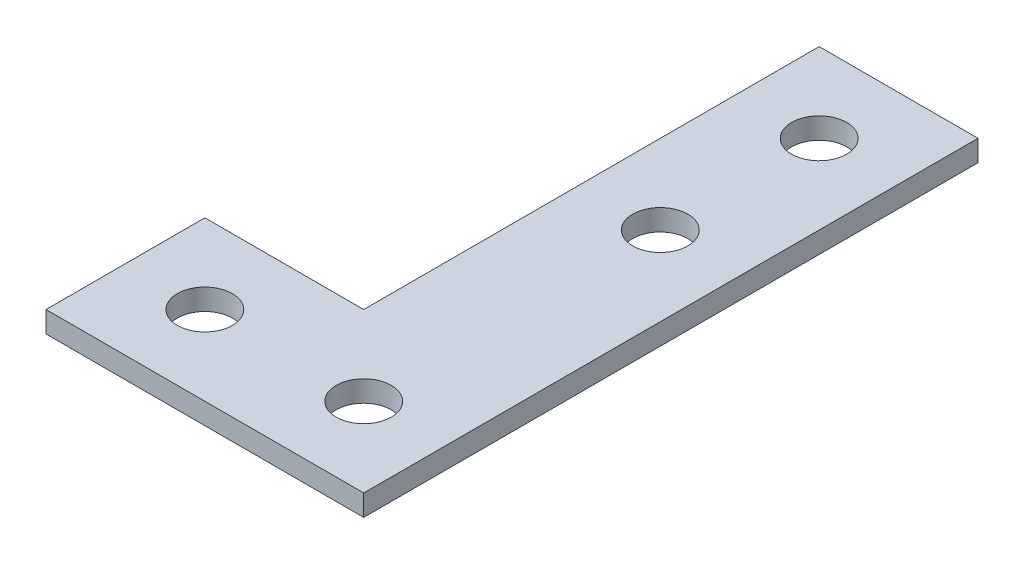
ISO-10303-21;
HEADER;
FILE_DESCRIPTION(('STEP AP214'),'2;1');
FILE_NAME('part.step','',(''),(''),'','','');
FILE_SCHEMA(('AUTOMOTIVE_DESIGN { 1 0 10303 214 1 1 1 1 }'));
ENDSEC;
DATA;
#1=APPLICATION_CONTEXT('core data for automotive mechanical design processes');
#2=APPLICATION_PROTOCOL_DEFINITION('international standard','automotive_design',2000,#1);
#3=PRODUCT_CONTEXT('',#1,'mechanical');
#4=PRODUCT('Part','Part','',(#3));
#5=PRODUCT_RELATED_PRODUCT_CATEGORY('part','',(#4));
#6=PRODUCT_DEFINITION_FORMATION('','',#4);
#7=PRODUCT_DEFINITION_CONTEXT('part definition',#1,'design');
#8=PRODUCT_DEFINITION('design','',#6,#7);
#9=PRODUCT_DEFINITION_SHAPE('','',#8);
#10=(LENGTH_UNIT() NAMED_UNIT(*) SI_UNIT(.MILLI.,.METRE.));
#11=(NAMED_UNIT(*) PLANE_ANGLE_UNIT() SI_UNIT($,.RADIAN.));
#12=(NAMED_UNIT(*) SI_UNIT($,.STERADIAN.) SOLID_ANGLE_UNIT());
#13=UNCERTAINTY_MEASURE_WITH_UNIT(LENGTH_MEASURE(1.E-05),#10,'distance_accuracy_value','');
#14=(GEOMETRIC_REPRESENTATION_CONTEXT(3) GLOBAL_UNCERTAINTY_ASSIGNED_CONTEXT((#13)) GLOBAL_UNIT_ASSIGNED_CONTEXT((#10,
#11,#12)) REPRESENTATION_CONTEXT('',''));
#15=CARTESIAN_POINT('',(0.,0.,0.));
#16=DIRECTION('',(0.,0.,1.));
#17=DIRECTION('',(1.,0.,0.));
#18=AXIS2_PLACEMENT_3D('',#15,#16,#17);
#19=CARTESIAN_POINT('',(7.5,2.,0.));
#20=DIRECTION('',(1.,0.,0.));
#21=DIRECTION('',(0.,0.,-1.));
#22=AXIS2_PLACEMENT_3D('',#19,#20,#21);
#23=PLANE('',#22);
#24=DIRECTION('',(0.,0.,1.));
#25=VECTOR('',#24,1.);
#26=CARTESIAN_POINT('',(7.5,0.,0.));
#27=LINE('',#26,#25);
#28=CARTESIAN_POINT('',(7.5,0.,-43.));
#29=VERTEX_POINT('',#28);
#30=CARTESIAN_POINT('',(7.5,0.,15.));
#31=VERTEX_POINT('',#30);
#32=EDGE_CURVE('E148',#29,#31,#27,.T.);
#33=ORIENTED_EDGE('',*,*,#32,.F.);
#34=DIRECTION('',(0.,-1.,0.));
#35=VECTOR('',#34,1.);
#36=CARTESIAN_POINT('',(7.5,2.,-43.));
#37=LINE('',#36,#35);
#38=CARTESIAN_POINT('',(7.5,2.,-43.));
#39=VERTEX_POINT('',#38);
#40=EDGE_CURVE('E11',#39,#29,#37,.T.);
#41=ORIENTED_EDGE('',*,*,#40,.F.);
#42=DIRECTION('',(0.,0.,1.));
#43=VECTOR('',#42,1.);
#44=CARTESIAN_POINT('',(7.5,2.,0.));
#45=LINE('',#44,#43);
#46=CARTESIAN_POINT('',(7.5,2.,15.));
#47=VERTEX_POINT('',#46);
#48=EDGE_CURVE('E184',#39,#47,#45,.T.);
#49=ORIENTED_EDGE('',*,*,#48,.T.);
#50=DIRECTION('',(0.,-1.,0.));
#51=VECTOR('',#50,1.);
#52=CARTESIAN_POINT('',(7.5,2.,15.));
#53=LINE('',#52,#51);
#54=EDGE_CURVE('E62',#47,#31,#53,.T.);
#55=ORIENTED_EDGE('',*,*,#54,.T.);
#56=EDGE_LOOP('',(#33,#41,#49,#55));
#57=FACE_BOUND('',#56,.T.);
#58=ADVANCED_FACE('F45',(#57),#23,.T.);
#59=CARTESIAN_POINT('',(0.,2.,-43.));
#60=DIRECTION('',(0.,0.,-1.));
#61=DIRECTION('',(-1.,0.,0.));
#62=AXIS2_PLACEMENT_3D('',#59,#60,#61);
#63=PLANE('',#62);
#64=DIRECTION('',(1.,0.,0.));
#65=VECTOR('',#64,1.);
#66=CARTESIAN_POINT('',(0.,0.,-43.));
#67=LINE('',#66,#65);
#68=CARTESIAN_POINT('',(-7.5,0.,-43.));
#69=VERTEX_POINT('',#68);
#70=EDGE_CURVE('E151',#69,#29,#67,.T.);
#71=ORIENTED_EDGE('',*,*,#70,.F.);
#72=DIRECTION('',(0.,-1.,0.));
#73=VECTOR('',#72,1.);
#74=CARTESIAN_POINT('',(-7.5,2.,-43.));
#75=LINE('',#74,#73);
#76=CARTESIAN_POINT('',(-7.5,2.,-43.));
#77=VERTEX_POINT('',#76);
#78=EDGE_CURVE('E54',#77,#69,#75,.T.);
#79=ORIENTED_EDGE('',*,*,#78,.F.);
#80=DIRECTION('',(1.,0.,0.));
#81=VECTOR('',#80,1.);
#82=CARTESIAN_POINT('',(0.,2.,-43.));
#83=LINE('',#82,#81);
#84=EDGE_CURVE('E361',#77,#39,#83,.T.);
#85=ORIENTED_EDGE('',*,*,#84,.T.);
#86=ORIENTED_EDGE('',*,*,#40,.T.);
#87=EDGE_LOOP('',(#71,#79,#85,#86));
#88=FACE_BOUND('',#87,.T.);
#89=ADVANCED_FACE('F197',(#88),#63,.T.);
#90=CARTESIAN_POINT('',(-7.5,2.,0.));
#91=DIRECTION('',(-1.,0.,0.));
#92=DIRECTION('',(0.,0.,1.));
#93=AXIS2_PLACEMENT_3D('',#90,#91,#92);
#94=PLANE('',#93);
#95=DIRECTION('',(0.,0.,-1.));
#96=VECTOR('',#95,1.);
#97=CARTESIAN_POINT('',(-7.5,0.,0.));
#98=LINE('',#97,#96);
#99=CARTESIAN_POINT('',(-7.5,0.,0.));
#100=VERTEX_POINT('',#99);
#101=EDGE_CURVE('E155',#100,#69,#98,.T.);
#102=ORIENTED_EDGE('',*,*,#101,.F.);
#103=DIRECTION('',(0.,-1.,0.));
#104=VECTOR('',#103,1.);
#105=CARTESIAN_POINT('',(-7.5,2.,0.));
#106=LINE('',#105,#104);
#107=CARTESIAN_POINT('',(-7.5,2.,0.));
#108=VERTEX_POINT('',#107);
#109=EDGE_CURVE('E122',#108,#100,#106,.T.);
#110=ORIENTED_EDGE('',*,*,#109,.F.);
#111=DIRECTION('',(0.,0.,-1.));
#112=VECTOR('',#111,1.);
#113=CARTESIAN_POINT('',(-7.5,2.,0.));
#114=LINE('',#113,#112);
#115=EDGE_CURVE('E110',#108,#77,#114,.T.);
#116=ORIENTED_EDGE('',*,*,#115,.T.);
#117=ORIENTED_EDGE('',*,*,#78,.T.);
#118=EDGE_LOOP('',(#102,#110,#116,#117));
#119=FACE_BOUND('',#118,.T.);
#120=ADVANCED_FACE('F194',(#119),#94,.T.);
#121=CARTESIAN_POINT('',(0.,2.,0.));
#122=DIRECTION('',(0.,0.,1.));
#123=DIRECTION('',(1.,0.,0.));
#124=AXIS2_PLACEMENT_3D('',#121,#122,#123);
#125=PLANE('',#124);
#126=DIRECTION('',(-1.,0.,0.));
#127=VECTOR('',#126,1.);
#128=CARTESIAN_POINT('',(0.,0.,0.));
#129=LINE('',#128,#127);
#130=CARTESIAN_POINT('',(-22.5,0.,0.));
#131=VERTEX_POINT('',#130);
#132=EDGE_CURVE('E118',#100,#131,#129,.T.);
#133=ORIENTED_EDGE('',*,*,#132,.T.);
#134=DIRECTION('',(0.,-1.,0.));
#135=VECTOR('',#134,1.);
#136=CARTESIAN_POINT('',(-22.5,2.,0.));
#137=LINE('',#136,#135);
#138=CARTESIAN_POINT('',(-22.5,2.,0.));
#139=VERTEX_POINT('',#138);
#140=EDGE_CURVE('E115',#139,#131,#137,.T.);
#141=ORIENTED_EDGE('',*,*,#140,.F.);
#142=DIRECTION('',(-1.,0.,0.));
#143=VECTOR('',#142,1.);
#144=CARTESIAN_POINT('',(0.,2.,0.));
#145=LINE('',#144,#143);
#146=EDGE_CURVE('E101',#108,#139,#145,.T.);
#147=ORIENTED_EDGE('',*,*,#146,.F.);
#148=ORIENTED_EDGE('',*,*,#109,.T.);
#149=EDGE_LOOP('',(#133,#141,#147,#148));
#150=FACE_BOUND('',#149,.T.);
#151=ADVANCED_FACE('F116',(#150),#125,.F.);
#152=CARTESIAN_POINT('',(-22.5,2.,0.));
#153=DIRECTION('',(1.,0.,0.));
#154=DIRECTION('',(0.,0.,-1.));
#155=AXIS2_PLACEMENT_3D('',#152,#153,#154);
#156=PLANE('',#155);
#157=DIRECTION('',(0.,0.,1.));
#158=VECTOR('',#157,1.);
#159=CARTESIAN_POINT('',(-22.5,0.,0.));
#160=LINE('',#159,#158);
#161=CARTESIAN_POINT('',(-22.5,0.,15.));
#162=VERTEX_POINT('',#161);
#163=EDGE_CURVE('E161',#131,#162,#160,.T.);
#164=ORIENTED_EDGE('',*,*,#163,.T.);
#165=DIRECTION('',(0.,-1.,0.));
#166=VECTOR('',#165,1.);
#167=CARTESIAN_POINT('',(-22.5,2.,15.));
#168=LINE('',#167,#166);
#169=CARTESIAN_POINT('',(-22.5,2.,15.));
#170=VERTEX_POINT('',#169);
#171=EDGE_CURVE('E82',#170,#162,#168,.T.);
#172=ORIENTED_EDGE('',*,*,#171,.F.);
#173=DIRECTION('',(0.,0.,1.));
#174=VECTOR('',#173,1.);
#175=CARTESIAN_POINT('',(-22.5,2.,0.));
#176=LINE('',#175,#174);
#177=EDGE_CURVE('E107',#139,#170,#176,.T.);
#178=ORIENTED_EDGE('',*,*,#177,.F.);
#179=ORIENTED_EDGE('',*,*,#140,.T.);
#180=EDGE_LOOP('',(#164,#172,#178,#179));
#181=FACE_BOUND('',#180,.T.);
#182=ADVANCED_FACE('F124',(#181),#156,.F.);
#183=CARTESIAN_POINT('',(-15.,2.,7.5));
#184=DIRECTION('',(0.,-1.,0.));
#185=DIRECTION('',(0.,0.,-1.));
#186=AXIS2_PLACEMENT_3D('',#183,#184,#185);
#187=CYLINDRICAL_SURFACE('',#186,2.6);
#188=CARTESIAN_POINT('',(-15.,2.,7.5));
#189=DIRECTION('',(0.,1.,0.));
#190=DIRECTION('',(0.,0.,1.));
#191=AXIS2_PLACEMENT_3D('',#188,#189,#190);
#192=CIRCLE('',#191,2.6);
#193=CARTESIAN_POINT('',(-15.,2.,10.1));
#194=VERTEX_POINT('',#193);
#195=EDGE_CURVE('E140',#194,#194,#192,.T.);
#196=ORIENTED_EDGE('',*,*,#195,.T.);
#197=EDGE_LOOP('',(#196));
#198=FACE_BOUND('',#197,.T.);
#199=CARTESIAN_POINT('',(-15.,0.,7.5));
#200=DIRECTION('',(0.,1.,0.));
#201=DIRECTION('',(0.,0.,1.));
#202=AXIS2_PLACEMENT_3D('',#199,#200,#201);
#203=CIRCLE('',#202,2.6);
#204=CARTESIAN_POINT('',(-15.,0.,10.1));
#205=VERTEX_POINT('',#204);
#206=EDGE_CURVE('E176',#205,#205,#203,.T.);
#207=ORIENTED_EDGE('',*,*,#206,.F.);
#208=EDGE_LOOP('',(#207));
#209=FACE_BOUND('',#208,.T.);
#210=ADVANCED_FACE('F227',(#198,#209),#187,.F.);
#211=CARTESIAN_POINT('',(0.,2.,-20.5));
#212=DIRECTION('',(0.,-1.,0.));
#213=DIRECTION('',(0.,0.,-1.));
#214=AXIS2_PLACEMENT_3D('',#211,#212,#213);
#215=CYLINDRICAL_SURFACE('',#214,2.6);
#216=CARTESIAN_POINT('',(0.,2.,-20.5));
#217=DIRECTION('',(0.,1.,0.));
#218=DIRECTION('',(0.,0.,1.));
#219=AXIS2_PLACEMENT_3D('',#216,#217,#218);
#220=CIRCLE('',#219,2.6);
#221=CARTESIAN_POINT('',(0.,2.,-17.9));
#222=VERTEX_POINT('',#221);
#223=EDGE_CURVE('E136',#222,#222,#220,.T.);
#224=ORIENTED_EDGE('',*,*,#223,.T.);
#225=EDGE_LOOP('',(#224));
#226=FACE_BOUND('',#225,.T.);
#227=CARTESIAN_POINT('',(0.,0.,-20.5));
#228=DIRECTION('',(0.,1.,0.));
#229=DIRECTION('',(0.,0.,1.));
#230=AXIS2_PLACEMENT_3D('',#227,#228,#229);
#231=CIRCLE('',#230,2.6);
#232=CARTESIAN_POINT('',(0.,0.,-17.9));
#233=VERTEX_POINT('',#232);
#234=EDGE_CURVE('E172',#233,#233,#231,.T.);
#235=ORIENTED_EDGE('',*,*,#234,.F.);
#236=EDGE_LOOP('',(#235));
#237=FACE_BOUND('',#236,.T.);
#238=ADVANCED_FACE('F212',(#226,#237),#215,.F.);
#239=CARTESIAN_POINT('',(0.,2.,-35.5));
#240=DIRECTION('',(0.,-1.,0.));
#241=DIRECTION('',(0.,0.,-1.));
#242=AXIS2_PLACEMENT_3D('',#239,#240,#241);
#243=CYLINDRICAL_SURFACE('',#242,2.6);
#244=CARTESIAN_POINT('',(0.,2.,-35.5));
#245=DIRECTION('',(0.,1.,0.));
#246=DIRECTION('',(0.,0.,1.));
#247=AXIS2_PLACEMENT_3D('',#244,#245,#246);
#248=CIRCLE('',#247,2.6);
#249=CARTESIAN_POINT('',(0.,2.,-32.9));
#250=VERTEX_POINT('',#249);
#251=EDGE_CURVE('E129',#250,#250,#248,.F.);
#252=ORIENTED_EDGE('',*,*,#251,.F.);
#253=EDGE_LOOP('',(#252));
#254=FACE_BOUND('',#253,.T.);
#255=CARTESIAN_POINT('',(0.,0.,-35.5));
#256=DIRECTION('',(0.,1.,0.));
#257=DIRECTION('',(0.,0.,1.));
#258=AXIS2_PLACEMENT_3D('',#255,#256,#257);
#259=CIRCLE('',#258,2.6);
#260=CARTESIAN_POINT('',(0.,0.,-32.9));
#261=VERTEX_POINT('',#260);
#262=EDGE_CURVE('E168',#261,#261,#259,.F.);
#263=ORIENTED_EDGE('',*,*,#262,.T.);
#264=EDGE_LOOP('',(#263));
#265=FACE_BOUND('',#264,.T.);
#266=ADVANCED_FACE('F204',(#254,#265),#243,.F.);
#267=CARTESIAN_POINT('',(0.,2.,15.));
#268=DIRECTION('',(0.,0.,1.));
#269=DIRECTION('',(1.,0.,0.));
#270=AXIS2_PLACEMENT_3D('',#267,#268,#269);
#271=PLANE('',#270);
#272=DIRECTION('',(-1.,0.,0.));
#273=VECTOR('',#272,1.);
#274=CARTESIAN_POINT('',(0.,0.,15.));
#275=LINE('',#274,#273);
#276=EDGE_CURVE('E164',#31,#162,#275,.T.);
#277=ORIENTED_EDGE('',*,*,#276,.F.);
#278=ORIENTED_EDGE('',*,*,#54,.F.);
#279=DIRECTION('',(-1.,0.,0.));
#280=VECTOR('',#279,1.);
#281=CARTESIAN_POINT('',(0.,2.,15.));
#282=LINE('',#281,#280);
#283=EDGE_CURVE('E126',#47,#170,#282,.T.);
#284=ORIENTED_EDGE('',*,*,#283,.T.);
#285=ORIENTED_EDGE('',*,*,#171,.T.);
#286=EDGE_LOOP('',(#277,#278,#284,#285));
#287=FACE_BOUND('',#286,.T.);
#288=ADVANCED_FACE('F201',(#287),#271,.T.);
#289=CARTESIAN_POINT('',(0.,2.,7.5));
#290=DIRECTION('',(0.,-1.,0.));
#291=DIRECTION('',(0.,0.,-1.));
#292=AXIS2_PLACEMENT_3D('',#289,#290,#291);
#293=CYLINDRICAL_SURFACE('',#292,2.6);
#294=CARTESIAN_POINT('',(0.,2.,7.5));
#295=DIRECTION('',(0.,1.,0.));
#296=DIRECTION('',(0.,0.,1.));
#297=AXIS2_PLACEMENT_3D('',#294,#295,#296);
#298=CIRCLE('',#297,2.6);
#299=CARTESIAN_POINT('',(0.,2.,10.1));
#300=VERTEX_POINT('',#299);
#301=EDGE_CURVE('E144',#300,#300,#298,.F.);
#302=ORIENTED_EDGE('',*,*,#301,.F.);
#303=EDGE_LOOP('',(#302));
#304=FACE_BOUND('',#303,.T.);
#305=CARTESIAN_POINT('',(0.,0.,7.5));
#306=DIRECTION('',(0.,1.,0.));
#307=DIRECTION('',(0.,0.,1.));
#308=AXIS2_PLACEMENT_3D('',#305,#306,#307);
#309=CIRCLE('',#308,2.6);
#310=CARTESIAN_POINT('',(0.,0.,10.1));
#311=VERTEX_POINT('',#310);
#312=EDGE_CURVE('E180',#311,#311,#309,.F.);
#313=ORIENTED_EDGE('',*,*,#312,.T.);
#314=EDGE_LOOP('',(#313));
#315=FACE_BOUND('',#314,.T.);
#316=ADVANCED_FACE('F203',(#304,#315),#293,.F.);
#317=CARTESIAN_POINT('',(0.,2.,0.));
#318=DIRECTION('',(0.,1.,0.));
#319=DIRECTION('',(0.,0.,1.));
#320=AXIS2_PLACEMENT_3D('',#317,#318,#319);
#321=PLANE('',#320);
#322=ORIENTED_EDGE('',*,*,#48,.F.);
#323=ORIENTED_EDGE('',*,*,#84,.F.);
#324=ORIENTED_EDGE('',*,*,#115,.F.);
#325=ORIENTED_EDGE('',*,*,#146,.T.);
#326=ORIENTED_EDGE('',*,*,#177,.T.);
#327=ORIENTED_EDGE('',*,*,#283,.F.);
#328=EDGE_LOOP('',(#322,#323,#324,#325,#326,#327));
#329=FACE_BOUND('',#328,.T.);
#330=ORIENTED_EDGE('',*,*,#251,.T.);
#331=EDGE_LOOP('',(#330));
#332=FACE_BOUND('',#331,.T.);
#333=ORIENTED_EDGE('',*,*,#223,.F.);
#334=EDGE_LOOP('',(#333));
#335=FACE_BOUND('',#334,.T.);
#336=ORIENTED_EDGE('',*,*,#195,.F.);
#337=EDGE_LOOP('',(#336));
#338=FACE_BOUND('',#337,.T.);
#339=ORIENTED_EDGE('',*,*,#301,.T.);
#340=EDGE_LOOP('',(#339));
#341=FACE_BOUND('',#340,.T.);
#342=ADVANCED_FACE('F103',(#329,#332,#335,#338,#341),#321,.T.);
#343=CARTESIAN_POINT('',(0.,0.,0.));
#344=DIRECTION('',(0.,1.,0.));
#345=DIRECTION('',(0.,0.,1.));
#346=AXIS2_PLACEMENT_3D('',#343,#344,#345);
#347=PLANE('',#346);
#348=ORIENTED_EDGE('',*,*,#32,.T.);
#349=ORIENTED_EDGE('',*,*,#276,.T.);
#350=ORIENTED_EDGE('',*,*,#163,.F.);
#351=ORIENTED_EDGE('',*,*,#132,.F.);
#352=ORIENTED_EDGE('',*,*,#101,.T.);
#353=ORIENTED_EDGE('',*,*,#70,.T.);
#354=EDGE_LOOP('',(#348,#349,#350,#351,#352,#353));
#355=FACE_BOUND('',#354,.T.);
#356=ORIENTED_EDGE('',*,*,#262,.F.);
#357=EDGE_LOOP('',(#356));
#358=FACE_BOUND('',#357,.T.);
#359=ORIENTED_EDGE('',*,*,#234,.T.);
#360=EDGE_LOOP('',(#359));
#361=FACE_BOUND('',#360,.T.);
#362=ORIENTED_EDGE('',*,*,#206,.T.);
#363=EDGE_LOOP('',(#362));
#364=FACE_BOUND('',#363,.T.);
#365=ORIENTED_EDGE('',*,*,#312,.F.);
#366=EDGE_LOOP('',(#365));
#367=FACE_BOUND('',#366,.T.);
#368=ADVANCED_FACE('F199',(#355,#358,#361,#364,#367),#347,.F.);
#369=CLOSED_SHELL('',(#58,#89,#120,#151,#182,#210,#238,#266,#288,#316,#342,#368));
#370=MANIFOLD_SOLID_BREP('B2',#369);
#371=ADVANCED_BREP_SHAPE_REPRESENTATION('',(#18,#370),#14);
#372=SHAPE_DEFINITION_REPRESENTATION(#9,#371);
ENDSEC;
END-ISO-10303-21;
